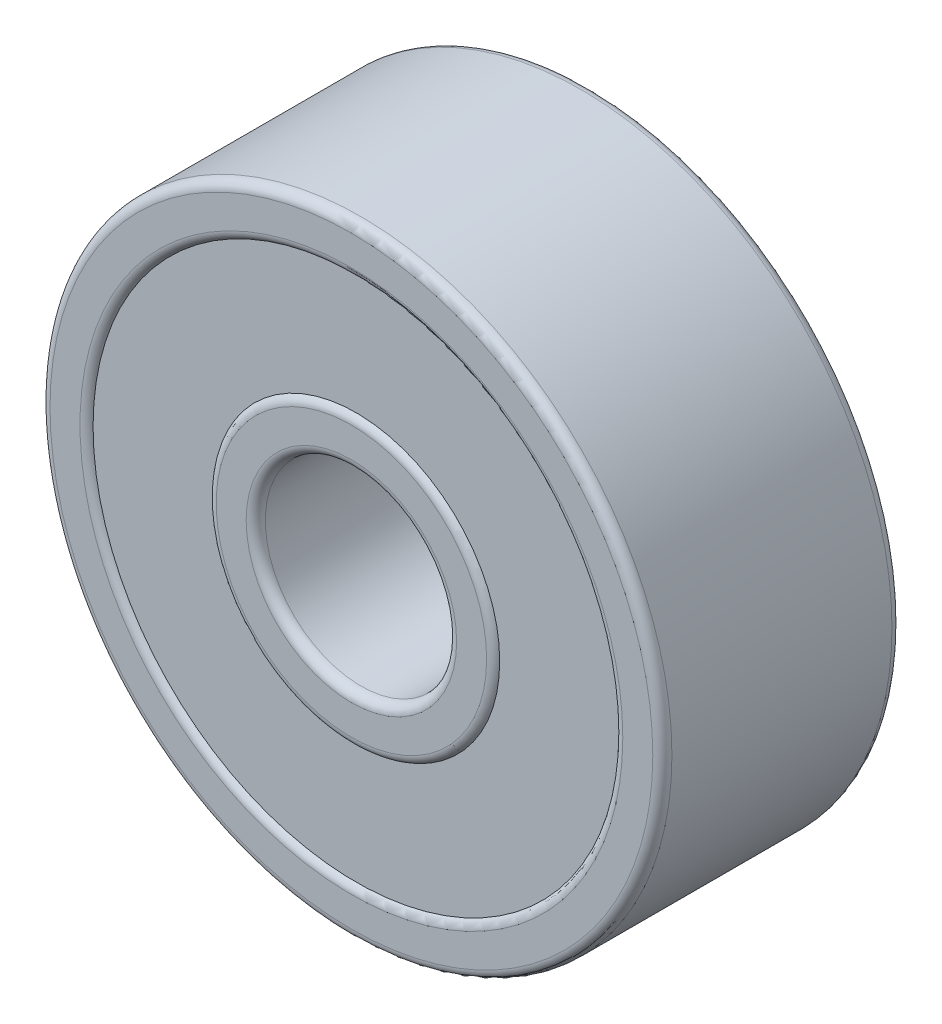
ISO-10303-21;
HEADER;
FILE_DESCRIPTION(('STEP AP214'),'2;1');
FILE_NAME('part.step','',(''),(''),'','','');
FILE_SCHEMA(('AUTOMOTIVE_DESIGN { 1 0 10303 214 1 1 1 1 }'));
ENDSEC;
DATA;
#1=APPLICATION_CONTEXT('core data for automotive mechanical design processes');
#2=APPLICATION_PROTOCOL_DEFINITION('international standard','automotive_design',2000,#1);
#3=PRODUCT_CONTEXT('',#1,'mechanical');
#4=PRODUCT('Part','Part','',(#3));
#5=PRODUCT_RELATED_PRODUCT_CATEGORY('part','',(#4));
#6=PRODUCT_DEFINITION_FORMATION('','',#4);
#7=PRODUCT_DEFINITION_CONTEXT('part definition',#1,'design');
#8=PRODUCT_DEFINITION('design','',#6,#7);
#9=PRODUCT_DEFINITION_SHAPE('','',#8);
#10=(LENGTH_UNIT() NAMED_UNIT(*) SI_UNIT(.MILLI.,.METRE.));
#11=(NAMED_UNIT(*) PLANE_ANGLE_UNIT() SI_UNIT($,.RADIAN.));
#12=(NAMED_UNIT(*) SI_UNIT($,.STERADIAN.) SOLID_ANGLE_UNIT());
#13=UNCERTAINTY_MEASURE_WITH_UNIT(LENGTH_MEASURE(1.E-05),#10,'distance_accuracy_value','');
#14=(GEOMETRIC_REPRESENTATION_CONTEXT(3) GLOBAL_UNCERTAINTY_ASSIGNED_CONTEXT((#13)) GLOBAL_UNIT_ASSIGNED_CONTEXT((#10,
#11,#12)) REPRESENTATION_CONTEXT('',''));
#15=CARTESIAN_POINT('',(0.,0.,0.));
#16=DIRECTION('',(0.,0.,1.));
#17=DIRECTION('',(1.,0.,0.));
#18=AXIS2_PLACEMENT_3D('',#15,#16,#17);
#19=CARTESIAN_POINT('',(0.,-14.4414213562373,5.));
#20=DIRECTION('',(0.,0.,1.));
#21=DIRECTION('',(1.,0.,0.));
#22=AXIS2_PLACEMENT_3D('',#19,#20,#21);
#23=PLANE('',#22);
#24=CARTESIAN_POINT('',(0.,0.,5.));
#25=DIRECTION('',(0.,0.,1.));
#26=DIRECTION('',(1.,0.,0.));
#27=AXIS2_PLACEMENT_3D('',#24,#25,#26);
#28=CIRCLE('',#27,2.2);
#29=CARTESIAN_POINT('',(2.2,0.,5.));
#30=VERTEX_POINT('',#29);
#31=EDGE_CURVE('E61',#30,#30,#28,.F.);
#32=ORIENTED_EDGE('',*,*,#31,.T.);
#33=EDGE_LOOP('',(#32));
#34=FACE_BOUND('',#33,.T.);
#35=CARTESIAN_POINT('',(0.,0.,5.));
#36=DIRECTION('',(0.,0.,1.));
#37=DIRECTION('',(1.,0.,0.));
#38=AXIS2_PLACEMENT_3D('',#35,#36,#37);
#39=CIRCLE('',#38,2.82679491924311);
#40=CARTESIAN_POINT('',(2.82679491924311,0.,5.));
#41=VERTEX_POINT('',#40);
#42=EDGE_CURVE('E64',#41,#41,#39,.T.);
#43=ORIENTED_EDGE('',*,*,#42,.T.);
#44=EDGE_LOOP('',(#43));
#45=FACE_BOUND('',#44,.T.);
#46=ADVANCED_FACE('F35',(#34,#45),#23,.T.);
#47=CARTESIAN_POINT('',(0.,-14.4414213562373,0.));
#48=DIRECTION('',(0.,0.,1.));
#49=DIRECTION('',(1.,0.,0.));
#50=AXIS2_PLACEMENT_3D('',#47,#48,#49);
#51=PLANE('',#50);
#52=CARTESIAN_POINT('',(0.,0.,0.));
#53=DIRECTION('',(0.,0.,1.));
#54=DIRECTION('',(1.,0.,0.));
#55=AXIS2_PLACEMENT_3D('',#52,#53,#54);
#56=CIRCLE('',#55,6.3);
#57=CARTESIAN_POINT('',(6.3,0.,0.));
#58=VERTEX_POINT('',#57);
#59=EDGE_CURVE('E46',#58,#58,#56,.F.);
#60=ORIENTED_EDGE('',*,*,#59,.T.);
#61=EDGE_LOOP('',(#60));
#62=FACE_BOUND('',#61,.T.);
#63=CARTESIAN_POINT('',(0.,0.,0.));
#64=DIRECTION('',(0.,0.,1.));
#65=DIRECTION('',(1.,0.,0.));
#66=AXIS2_PLACEMENT_3D('',#63,#64,#65);
#67=CIRCLE('',#66,5.67320508075689);
#68=CARTESIAN_POINT('',(5.67320508075689,0.,0.));
#69=VERTEX_POINT('',#68);
#70=EDGE_CURVE('E50',#69,#69,#67,.T.);
#71=ORIENTED_EDGE('',*,*,#70,.T.);
#72=EDGE_LOOP('',(#71));
#73=FACE_BOUND('',#72,.T.);
#74=ADVANCED_FACE('F116',(#62,#73),#51,.F.);
#75=CARTESIAN_POINT('',(0.,0.,5.));
#76=DIRECTION('',(0.,0.,-1.));
#77=DIRECTION('',(-1.,0.,0.));
#78=AXIS2_PLACEMENT_3D('',#75,#76,#77);
#79=CYLINDRICAL_SURFACE('',#78,6.5);
#80=CARTESIAN_POINT('',(0.,0.,0.2));
#81=DIRECTION('',(0.,0.,1.));
#82=DIRECTION('',(1.,0.,0.));
#83=AXIS2_PLACEMENT_3D('',#80,#81,#82);
#84=CIRCLE('',#83,6.5);
#85=CARTESIAN_POINT('',(6.5,0.,0.2));
#86=VERTEX_POINT('',#85);
#87=EDGE_CURVE('E55',#86,#86,#84,.T.);
#88=ORIENTED_EDGE('',*,*,#87,.T.);
#89=EDGE_LOOP('',(#88));
#90=FACE_BOUND('',#89,.T.);
#91=CARTESIAN_POINT('',(0.,0.,4.8));
#92=DIRECTION('',(0.,0.,1.));
#93=DIRECTION('',(1.,0.,0.));
#94=AXIS2_PLACEMENT_3D('',#91,#92,#93);
#95=CIRCLE('',#94,6.5);
#96=CARTESIAN_POINT('',(6.5,0.,4.8));
#97=VERTEX_POINT('',#96);
#98=EDGE_CURVE('E58',#97,#97,#95,.F.);
#99=ORIENTED_EDGE('',*,*,#98,.T.);
#100=EDGE_LOOP('',(#99));
#101=FACE_BOUND('',#100,.T.);
#102=ADVANCED_FACE('F123',(#90,#101),#79,.T.);
#103=CARTESIAN_POINT('',(0.,0.,5.));
#104=DIRECTION('',(0.,0.,-1.));
#105=DIRECTION('',(-1.,0.,0.));
#106=AXIS2_PLACEMENT_3D('',#103,#104,#105);
#107=CYLINDRICAL_SURFACE('',#106,2.);
#108=CARTESIAN_POINT('',(0.,0.,0.2));
#109=DIRECTION('',(0.,0.,1.));
#110=DIRECTION('',(1.,0.,0.));
#111=AXIS2_PLACEMENT_3D('',#108,#109,#110);
#112=CIRCLE('',#111,2.);
#113=CARTESIAN_POINT('',(2.,0.,0.2));
#114=VERTEX_POINT('',#113);
#115=EDGE_CURVE('E67',#114,#114,#112,.F.);
#116=ORIENTED_EDGE('',*,*,#115,.T.);
#117=EDGE_LOOP('',(#116));
#118=FACE_BOUND('',#117,.T.);
#119=CARTESIAN_POINT('',(0.,0.,4.8));
#120=DIRECTION('',(0.,0.,1.));
#121=DIRECTION('',(1.,0.,0.));
#122=AXIS2_PLACEMENT_3D('',#119,#120,#121);
#123=CIRCLE('',#122,2.);
#124=CARTESIAN_POINT('',(2.,0.,4.8));
#125=VERTEX_POINT('',#124);
#126=EDGE_CURVE('E70',#125,#125,#123,.T.);
#127=ORIENTED_EDGE('',*,*,#126,.T.);
#128=EDGE_LOOP('',(#127));
#129=FACE_BOUND('',#128,.T.);
#130=ADVANCED_FACE('F130',(#118,#129),#107,.F.);
#131=CARTESIAN_POINT('',(0.,0.,5.));
#132=DIRECTION('',(0.,0.,1.));
#133=DIRECTION('',(1.,0.,0.));
#134=AXIS2_PLACEMENT_3D('',#131,#132,#133);
#135=CIRCLE('',#134,6.3);
#136=CARTESIAN_POINT('',(6.3,0.,5.));
#137=VERTEX_POINT('',#136);
#138=EDGE_CURVE('E10',#137,#137,#135,.T.);
#139=ORIENTED_EDGE('',*,*,#138,.T.);
#140=EDGE_LOOP('',(#139));
#141=FACE_BOUND('',#140,.T.);
#142=CARTESIAN_POINT('',(0.,0.,5.));
#143=DIRECTION('',(0.,0.,1.));
#144=DIRECTION('',(1.,0.,0.));
#145=AXIS2_PLACEMENT_3D('',#142,#143,#144);
#146=CIRCLE('',#145,5.67320508075689);
#147=CARTESIAN_POINT('',(5.67320508075689,0.,5.));
#148=VERTEX_POINT('',#147);
#149=EDGE_CURVE('E42',#148,#148,#146,.F.);
#150=ORIENTED_EDGE('',*,*,#149,.T.);
#151=EDGE_LOOP('',(#150));
#152=FACE_BOUND('',#151,.T.);
#153=ADVANCED_FACE('F119',(#141,#152),#23,.T.);
#154=CARTESIAN_POINT('',(0.,0.,0.));
#155=DIRECTION('',(0.,0.,1.));
#156=DIRECTION('',(1.,0.,0.));
#157=AXIS2_PLACEMENT_3D('',#154,#155,#156);
#158=CIRCLE('',#157,2.2);
#159=CARTESIAN_POINT('',(2.2,0.,0.));
#160=VERTEX_POINT('',#159);
#161=EDGE_CURVE('E73',#160,#160,#158,.T.);
#162=ORIENTED_EDGE('',*,*,#161,.T.);
#163=EDGE_LOOP('',(#162));
#164=FACE_BOUND('',#163,.T.);
#165=CARTESIAN_POINT('',(0.,0.,0.));
#166=DIRECTION('',(0.,0.,1.));
#167=DIRECTION('',(1.,0.,0.));
#168=AXIS2_PLACEMENT_3D('',#165,#166,#167);
#169=CIRCLE('',#168,2.82679491924311);
#170=CARTESIAN_POINT('',(2.82679491924311,0.,0.));
#171=VERTEX_POINT('',#170);
#172=EDGE_CURVE('E76',#171,#171,#169,.F.);
#173=ORIENTED_EDGE('',*,*,#172,.T.);
#174=EDGE_LOOP('',(#173));
#175=FACE_BOUND('',#174,.T.);
#176=ADVANCED_FACE('F126',(#164,#175),#51,.F.);
#177=CARTESIAN_POINT('',(0.,-14.4414213562373,0.1));
#178=DIRECTION('',(0.,0.,1.));
#179=DIRECTION('',(1.,0.,0.));
#180=AXIS2_PLACEMENT_3D('',#177,#178,#179);
#181=PLANE('',#180);
#182=CARTESIAN_POINT('',(0.,0.,0.1));
#183=DIRECTION('',(0.,0.,1.));
#184=DIRECTION('',(1.,0.,0.));
#185=AXIS2_PLACEMENT_3D('',#182,#183,#184);
#186=CIRCLE('',#185,3.);
#187=CARTESIAN_POINT('',(3.,0.,0.1));
#188=VERTEX_POINT('',#187);
#189=EDGE_CURVE('E82',#188,#188,#186,.T.);
#190=ORIENTED_EDGE('',*,*,#189,.T.);
#191=EDGE_LOOP('',(#190));
#192=FACE_BOUND('',#191,.T.);
#193=CARTESIAN_POINT('',(0.,0.,0.1));
#194=DIRECTION('',(0.,0.,1.));
#195=DIRECTION('',(1.,0.,0.));
#196=AXIS2_PLACEMENT_3D('',#193,#194,#195);
#197=CIRCLE('',#196,5.5);
#198=CARTESIAN_POINT('',(5.5,0.,0.1));
#199=VERTEX_POINT('',#198);
#200=EDGE_CURVE('E79',#199,#199,#197,.T.);
#201=ORIENTED_EDGE('',*,*,#200,.F.);
#202=EDGE_LOOP('',(#201));
#203=FACE_BOUND('',#202,.T.);
#204=ADVANCED_FACE('F99',(#192,#203),#181,.F.);
#205=CARTESIAN_POINT('',(0.,0.,4.9));
#206=DIRECTION('',(0.,0.,1.));
#207=DIRECTION('',(1.,0.,0.));
#208=AXIS2_PLACEMENT_3D('',#205,#206,#207);
#209=PLANE('',#208);
#210=CARTESIAN_POINT('',(0.,0.,4.9));
#211=DIRECTION('',(0.,0.,1.));
#212=DIRECTION('',(1.,0.,0.));
#213=AXIS2_PLACEMENT_3D('',#210,#211,#212);
#214=CIRCLE('',#213,3.);
#215=CARTESIAN_POINT('',(3.,0.,4.9));
#216=VERTEX_POINT('',#215);
#217=EDGE_CURVE('E88',#216,#216,#214,.T.);
#218=ORIENTED_EDGE('',*,*,#217,.F.);
#219=EDGE_LOOP('',(#218));
#220=FACE_BOUND('',#219,.T.);
#221=CARTESIAN_POINT('',(0.,0.,4.9));
#222=DIRECTION('',(0.,0.,1.));
#223=DIRECTION('',(1.,0.,0.));
#224=AXIS2_PLACEMENT_3D('',#221,#222,#223);
#225=CIRCLE('',#224,5.5);
#226=CARTESIAN_POINT('',(5.5,0.,4.9));
#227=VERTEX_POINT('',#226);
#228=EDGE_CURVE('E85',#227,#227,#225,.T.);
#229=ORIENTED_EDGE('',*,*,#228,.T.);
#230=EDGE_LOOP('',(#229));
#231=FACE_BOUND('',#230,.T.);
#232=ADVANCED_FACE('F95',(#220,#231),#209,.T.);
#233=CARTESIAN_POINT('',(0.,0.,0.2));
#234=DIRECTION('',(0.,0.,1.));
#235=DIRECTION('',(1.,0.,0.));
#236=AXIS2_PLACEMENT_3D('',#233,#234,#235);
#237=TOROIDAL_SURFACE('',#236,2.2,0.2);
#238=ORIENTED_EDGE('',*,*,#115,.F.);
#239=EDGE_LOOP('',(#238));
#240=FACE_BOUND('',#239,.T.);
#241=ORIENTED_EDGE('',*,*,#161,.F.);
#242=EDGE_LOOP('',(#241));
#243=FACE_BOUND('',#242,.T.);
#244=ADVANCED_FACE('F98',(#240,#243),#237,.T.);
#245=CARTESIAN_POINT('',(0.,0.,4.8));
#246=DIRECTION('',(0.,0.,1.));
#247=DIRECTION('',(1.,0.,0.));
#248=AXIS2_PLACEMENT_3D('',#245,#246,#247);
#249=TOROIDAL_SURFACE('',#248,2.2,0.2);
#250=ORIENTED_EDGE('',*,*,#31,.F.);
#251=EDGE_LOOP('',(#250));
#252=FACE_BOUND('',#251,.T.);
#253=ORIENTED_EDGE('',*,*,#126,.F.);
#254=EDGE_LOOP('',(#253));
#255=FACE_BOUND('',#254,.T.);
#256=ADVANCED_FACE('F147',(#252,#255),#249,.T.);
#257=CARTESIAN_POINT('',(0.,0.,0.2));
#258=DIRECTION('',(0.,0.,1.));
#259=DIRECTION('',(1.,0.,0.));
#260=AXIS2_PLACEMENT_3D('',#257,#258,#259);
#261=TOROIDAL_SURFACE('',#260,6.3,0.2);
#262=ORIENTED_EDGE('',*,*,#59,.F.);
#263=EDGE_LOOP('',(#262));
#264=FACE_BOUND('',#263,.T.);
#265=ORIENTED_EDGE('',*,*,#87,.F.);
#266=EDGE_LOOP('',(#265));
#267=FACE_BOUND('',#266,.T.);
#268=ADVANCED_FACE('F151',(#264,#267),#261,.T.);
#269=CARTESIAN_POINT('',(0.,0.,4.8));
#270=DIRECTION('',(0.,0.,1.));
#271=DIRECTION('',(1.,0.,0.));
#272=AXIS2_PLACEMENT_3D('',#269,#270,#271);
#273=TOROIDAL_SURFACE('',#272,6.3,0.2);
#274=ORIENTED_EDGE('',*,*,#98,.F.);
#275=EDGE_LOOP('',(#274));
#276=FACE_BOUND('',#275,.T.);
#277=ORIENTED_EDGE('',*,*,#138,.F.);
#278=EDGE_LOOP('',(#277));
#279=FACE_BOUND('',#278,.T.);
#280=ADVANCED_FACE('F113',(#276,#279),#273,.T.);
#281=CARTESIAN_POINT('',(0.,0.,4.8));
#282=DIRECTION('',(0.,0.,-1.));
#283=DIRECTION('',(-1.,0.,0.));
#284=AXIS2_PLACEMENT_3D('',#281,#282,#283);
#285=TOROIDAL_SURFACE('',#284,2.82679491924311,0.2);
#286=ORIENTED_EDGE('',*,*,#217,.T.);
#287=EDGE_LOOP('',(#286));
#288=FACE_BOUND('',#287,.T.);
#289=ORIENTED_EDGE('',*,*,#42,.F.);
#290=EDGE_LOOP('',(#289));
#291=FACE_BOUND('',#290,.T.);
#292=ADVANCED_FACE('F92',(#288,#291),#285,.T.);
#293=CARTESIAN_POINT('',(0.,0.,4.8));
#294=DIRECTION('',(0.,0.,1.));
#295=DIRECTION('',(1.,0.,0.));
#296=AXIS2_PLACEMENT_3D('',#293,#294,#295);
#297=TOROIDAL_SURFACE('',#296,5.67320508075689,0.2);
#298=ORIENTED_EDGE('',*,*,#149,.F.);
#299=EDGE_LOOP('',(#298));
#300=FACE_BOUND('',#299,.T.);
#301=ORIENTED_EDGE('',*,*,#228,.F.);
#302=EDGE_LOOP('',(#301));
#303=FACE_BOUND('',#302,.T.);
#304=ADVANCED_FACE('F103',(#300,#303),#297,.T.);
#305=CARTESIAN_POINT('',(0.,0.,0.2));
#306=DIRECTION('',(0.,0.,-1.));
#307=DIRECTION('',(-1.,0.,0.));
#308=AXIS2_PLACEMENT_3D('',#305,#306,#307);
#309=TOROIDAL_SURFACE('',#308,2.82679491924311,0.2);
#310=ORIENTED_EDGE('',*,*,#172,.F.);
#311=EDGE_LOOP('',(#310));
#312=FACE_BOUND('',#311,.T.);
#313=ORIENTED_EDGE('',*,*,#189,.F.);
#314=EDGE_LOOP('',(#313));
#315=FACE_BOUND('',#314,.T.);
#316=ADVANCED_FACE('F105',(#312,#315),#309,.T.);
#317=CARTESIAN_POINT('',(0.,0.,0.2));
#318=DIRECTION('',(0.,0.,1.));
#319=DIRECTION('',(1.,0.,0.));
#320=AXIS2_PLACEMENT_3D('',#317,#318,#319);
#321=TOROIDAL_SURFACE('',#320,5.67320508075689,0.2);
#322=ORIENTED_EDGE('',*,*,#200,.T.);
#323=EDGE_LOOP('',(#322));
#324=FACE_BOUND('',#323,.T.);
#325=ORIENTED_EDGE('',*,*,#70,.F.);
#326=EDGE_LOOP('',(#325));
#327=FACE_BOUND('',#326,.T.);
#328=ADVANCED_FACE('F37',(#324,#327),#321,.T.);
#329=CLOSED_SHELL('',(#46,#74,#102,#130,#153,#176,#204,#232,#244,#256,#268,#280,#292,#304,#316,#328));
#330=MANIFOLD_SOLID_BREP('B2',#329);
#331=ADVANCED_BREP_SHAPE_REPRESENTATION('',(#18,#330),#14);
#332=SHAPE_DEFINITION_REPRESENTATION(#9,#331);
ENDSEC;
END-ISO-10303-21;
